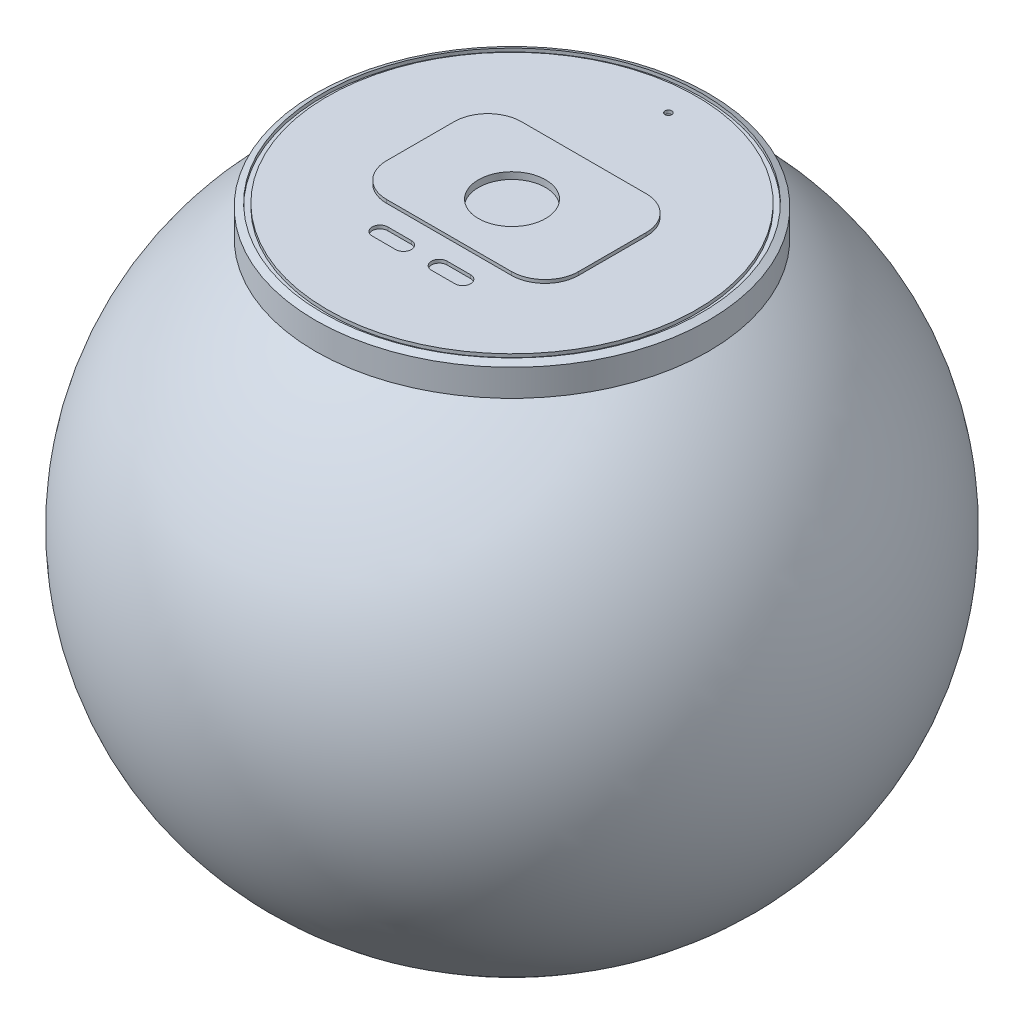
ISO-10303-21;
HEADER;
FILE_DESCRIPTION(('STEP AP214'),'2;1');
FILE_NAME('part.step','',(''),(''),'','','');
FILE_SCHEMA(('AUTOMOTIVE_DESIGN { 1 0 10303 214 1 1 1 1 }'));
ENDSEC;
DATA;
#1=APPLICATION_CONTEXT('core data for automotive mechanical design processes');
#2=APPLICATION_PROTOCOL_DEFINITION('international standard','automotive_design',2000,#1);
#3=PRODUCT_CONTEXT('',#1,'mechanical');
#4=PRODUCT('Part','Part','',(#3));
#5=PRODUCT_RELATED_PRODUCT_CATEGORY('part','',(#4));
#6=PRODUCT_DEFINITION_FORMATION('','',#4);
#7=PRODUCT_DEFINITION_CONTEXT('part definition',#1,'design');
#8=PRODUCT_DEFINITION('design','',#6,#7);
#9=PRODUCT_DEFINITION_SHAPE('','',#8);
#10=(LENGTH_UNIT() NAMED_UNIT(*) SI_UNIT(.MILLI.,.METRE.));
#11=(NAMED_UNIT(*) PLANE_ANGLE_UNIT() SI_UNIT($,.RADIAN.));
#12=(NAMED_UNIT(*) SI_UNIT($,.STERADIAN.) SOLID_ANGLE_UNIT());
#13=UNCERTAINTY_MEASURE_WITH_UNIT(LENGTH_MEASURE(1.E-05),#10,'distance_accuracy_value','');
#14=(GEOMETRIC_REPRESENTATION_CONTEXT(3) GLOBAL_UNCERTAINTY_ASSIGNED_CONTEXT((#13)) GLOBAL_UNIT_ASSIGNED_CONTEXT((#10,
#11,#12)) REPRESENTATION_CONTEXT('',''));
#15=CARTESIAN_POINT('',(0.,0.,0.));
#16=DIRECTION('',(0.,0.,1.));
#17=DIRECTION('',(1.,0.,0.));
#18=AXIS2_PLACEMENT_3D('',#15,#16,#17);
#19=CARTESIAN_POINT('',(0.,46.5,0.));
#20=DIRECTION('',(0.,1.,0.));
#21=DIRECTION('',(0.,0.,1.));
#22=AXIS2_PLACEMENT_3D('',#19,#20,#21);
#23=PLANE('',#22);
#24=CARTESIAN_POINT('',(0.,46.5,-23.2655117960917));
#25=DIRECTION('',(0.,1.,0.));
#26=DIRECTION('',(0.,0.,1.));
#27=AXIS2_PLACEMENT_3D('',#24,#25,#26);
#28=CIRCLE('',#27,0.5);
#29=CARTESIAN_POINT('',(0.,46.5,-22.7655117960917));
#30=VERTEX_POINT('',#29);
#31=EDGE_CURVE('E687',#30,#30,#28,.T.);
#32=ORIENTED_EDGE('',*,*,#31,.F.);
#33=EDGE_LOOP('',(#32));
#34=FACE_BOUND('',#33,.T.);
#35=CARTESIAN_POINT('',(2.66243900689331,46.5,13.4836984969019));
#36=DIRECTION('',(0.,1.,0.));
#37=DIRECTION('',(0.,0.,1.));
#38=AXIS2_PLACEMENT_3D('',#35,#36,#37);
#39=CIRCLE('',#38,1.16816311245161);
#40=CARTESIAN_POINT('',(2.66243900689331,46.5,12.3155353844502));
#41=VERTEX_POINT('',#40);
#42=CARTESIAN_POINT('',(2.66243900689331,46.5,14.6518616093535));
#43=VERTEX_POINT('',#42);
#44=EDGE_CURVE('E183',#41,#43,#39,.T.);
#45=ORIENTED_EDGE('',*,*,#44,.F.);
#46=DIRECTION('',(1.,0.,0.));
#47=VECTOR('',#46,1.);
#48=CARTESIAN_POINT('',(2.66243900689331,46.5,12.3155353844502));
#49=LINE('',#48,#47);
#50=CARTESIAN_POINT('',(6.158792875633,46.5,12.3155353844502));
#51=VERTEX_POINT('',#50);
#52=EDGE_CURVE('E198',#41,#51,#49,.T.);
#53=ORIENTED_EDGE('',*,*,#52,.T.);
#54=CARTESIAN_POINT('',(6.158792875633,46.5,13.4836984969019));
#55=DIRECTION('',(0.,-1.,0.));
#56=DIRECTION('',(0.,0.,-1.));
#57=AXIS2_PLACEMENT_3D('',#54,#55,#56);
#58=CIRCLE('',#57,1.16816311245161);
#59=CARTESIAN_POINT('',(6.158792875633,46.5,14.6518616093535));
#60=VERTEX_POINT('',#59);
#61=EDGE_CURVE('E211',#51,#60,#58,.T.);
#62=ORIENTED_EDGE('',*,*,#61,.T.);
#63=DIRECTION('',(-1.,0.,0.));
#64=VECTOR('',#63,1.);
#65=CARTESIAN_POINT('',(6.158792875633,46.5,14.6518616093535));
#66=LINE('',#65,#64);
#67=EDGE_CURVE('E187',#60,#43,#66,.T.);
#68=ORIENTED_EDGE('',*,*,#67,.T.);
#69=EDGE_LOOP('',(#45,#53,#62,#68));
#70=FACE_BOUND('',#69,.T.);
#71=CARTESIAN_POINT('',(-6.158792875633,46.5,13.4836984969019));
#72=DIRECTION('',(0.,1.,0.));
#73=DIRECTION('',(0.,0.,1.));
#74=AXIS2_PLACEMENT_3D('',#71,#72,#73);
#75=CIRCLE('',#74,1.16816311245161);
#76=CARTESIAN_POINT('',(-6.158792875633,46.5,12.3155353844502));
#77=VERTEX_POINT('',#76);
#78=CARTESIAN_POINT('',(-6.158792875633,46.5,14.6518616093535));
#79=VERTEX_POINT('',#78);
#80=EDGE_CURVE('E221',#77,#79,#75,.T.);
#81=ORIENTED_EDGE('',*,*,#80,.F.);
#82=DIRECTION('',(-1.,0.,0.));
#83=VECTOR('',#82,1.);
#84=CARTESIAN_POINT('',(-2.66243900689331,46.5,12.3155353844502));
#85=LINE('',#84,#83);
#86=CARTESIAN_POINT('',(-2.66243900689331,46.5,12.3155353844502));
#87=VERTEX_POINT('',#86);
#88=EDGE_CURVE('E236',#87,#77,#85,.T.);
#89=ORIENTED_EDGE('',*,*,#88,.F.);
#90=CARTESIAN_POINT('',(-2.66243900689331,46.5,13.4836984969019));
#91=DIRECTION('',(0.,-1.,0.));
#92=DIRECTION('',(0.,0.,-1.));
#93=AXIS2_PLACEMENT_3D('',#90,#91,#92);
#94=CIRCLE('',#93,1.16816311245161);
#95=CARTESIAN_POINT('',(-2.66243900689331,46.5,14.6518616093535));
#96=VERTEX_POINT('',#95);
#97=EDGE_CURVE('E254',#87,#96,#94,.T.);
#98=ORIENTED_EDGE('',*,*,#97,.T.);
#99=DIRECTION('',(1.,0.,0.));
#100=VECTOR('',#99,1.);
#101=CARTESIAN_POINT('',(-6.158792875633,46.5,14.6518616093535));
#102=LINE('',#101,#100);
#103=EDGE_CURVE('E250',#79,#96,#102,.T.);
#104=ORIENTED_EDGE('',*,*,#103,.F.);
#105=EDGE_LOOP('',(#81,#89,#98,#104));
#106=FACE_BOUND('',#105,.T.);
#107=CARTESIAN_POINT('',(0.,46.5,0.));
#108=DIRECTION('',(0.,1.,0.));
#109=DIRECTION('',(0.,0.,1.));
#110=AXIS2_PLACEMENT_3D('',#107,#108,#109);
#111=CIRCLE('',#110,27.4760373096274);
#112=CARTESIAN_POINT('',(0.,46.5,27.4760373096274));
#113=VERTEX_POINT('',#112);
#114=EDGE_CURVE('E264',#113,#113,#111,.T.);
#115=ORIENTED_EDGE('',*,*,#114,.T.);
#116=EDGE_LOOP('',(#115));
#117=FACE_BOUND('',#116,.T.);
#118=DIRECTION('',(-1.,0.,0.));
#119=VECTOR('',#118,1.);
#120=CARTESIAN_POINT('',(9.28476175773685,46.5,-10.6836380376832));
#121=LINE('',#120,#119);
#122=CARTESIAN_POINT('',(9.28476175773685,46.5,-10.6836380376832));
#123=VERTEX_POINT('',#122);
#124=CARTESIAN_POINT('',(-9.28476175773685,46.5,-10.6836380376832));
#125=VERTEX_POINT('',#124);
#126=EDGE_CURVE('E60',#123,#125,#121,.T.);
#127=ORIENTED_EDGE('',*,*,#126,.F.);
#128=CARTESIAN_POINT('',(9.28476175773688,46.5,-5.6836380376832));
#129=DIRECTION('',(0.,1.,0.));
#130=DIRECTION('',(0.,0.,1.));
#131=AXIS2_PLACEMENT_3D('',#128,#129,#130);
#132=CIRCLE('',#131,5.);
#133=CARTESIAN_POINT('',(14.2847617577369,46.5,-5.68363803768316));
#134=VERTEX_POINT('',#133);
#135=EDGE_CURVE('E181',#134,#123,#132,.T.);
#136=ORIENTED_EDGE('',*,*,#135,.F.);
#137=DIRECTION('',(0.,0.,1.));
#138=VECTOR('',#137,1.);
#139=CARTESIAN_POINT('',(14.2847617577369,46.5,-5.68363803768316));
#140=LINE('',#139,#138);
#141=CARTESIAN_POINT('',(14.2847617577369,46.5,4.36761589266245));
#142=VERTEX_POINT('',#141);
#143=EDGE_CURVE('E178',#134,#142,#140,.T.);
#144=ORIENTED_EDGE('',*,*,#143,.T.);
#145=CARTESIAN_POINT('',(9.28476175773688,46.5,4.36761589266248));
#146=DIRECTION('',(0.,-1.,0.));
#147=DIRECTION('',(0.,0.,-1.));
#148=AXIS2_PLACEMENT_3D('',#145,#146,#147);
#149=CIRCLE('',#148,5.);
#150=CARTESIAN_POINT('',(9.28476175773688,46.5,9.36761589266248));
#151=VERTEX_POINT('',#150);
#152=EDGE_CURVE('E736',#142,#151,#149,.T.);
#153=ORIENTED_EDGE('',*,*,#152,.T.);
#154=DIRECTION('',(1.,0.,0.));
#155=VECTOR('',#154,1.);
#156=CARTESIAN_POINT('',(-9.28476175773685,46.5,9.36761589266248));
#157=LINE('',#156,#155);
#158=CARTESIAN_POINT('',(-9.28476175773685,46.5,9.36761589266248));
#159=VERTEX_POINT('',#158);
#160=EDGE_CURVE('E732',#159,#151,#157,.T.);
#161=ORIENTED_EDGE('',*,*,#160,.F.);
#162=CARTESIAN_POINT('',(-9.28476175773688,46.5,4.36761589266248));
#163=DIRECTION('',(0.,1.,0.));
#164=DIRECTION('',(0.,0.,1.));
#165=AXIS2_PLACEMENT_3D('',#162,#163,#164);
#166=CIRCLE('',#165,5.);
#167=CARTESIAN_POINT('',(-14.2847617577369,46.5,4.36761589266245));
#168=VERTEX_POINT('',#167);
#169=EDGE_CURVE('E728',#168,#159,#166,.T.);
#170=ORIENTED_EDGE('',*,*,#169,.F.);
#171=DIRECTION('',(0.,0.,1.));
#172=VECTOR('',#171,1.);
#173=CARTESIAN_POINT('',(-14.2847617577369,46.5,-5.68363803768316));
#174=LINE('',#173,#172);
#175=CARTESIAN_POINT('',(-14.2847617577369,46.5,-5.68363803768316));
#176=VERTEX_POINT('',#175);
#177=EDGE_CURVE('E724',#176,#168,#174,.T.);
#178=ORIENTED_EDGE('',*,*,#177,.F.);
#179=CARTESIAN_POINT('',(-9.28476175773688,46.5,-5.6836380376832));
#180=DIRECTION('',(0.,1.,0.));
#181=DIRECTION('',(0.,0.,1.));
#182=AXIS2_PLACEMENT_3D('',#179,#180,#181);
#183=CIRCLE('',#182,5.);
#184=EDGE_CURVE('E65',#125,#176,#183,.T.);
#185=ORIENTED_EDGE('',*,*,#184,.F.);
#186=EDGE_LOOP('',(#127,#136,#144,#153,#161,#170,#178,#185));
#187=FACE_BOUND('',#186,.T.);
#188=ADVANCED_FACE('F44',(#34,#70,#106,#117,#187),#23,.T.);
#189=CARTESIAN_POINT('',(0.,4.69373689625829,0.));
#190=DIRECTION('',(0.,-1.,0.));
#191=DIRECTION('',(1.,0.,0.));
#192=AXIS2_PLACEMENT_3D('',#189,#190,#191);
#193=DEGENERATE_TOROIDAL_SURFACE('',#192,4.0728030425194,45.,.T.);
#194=CARTESIAN_POINT('',(0.,42.,0.));
#195=DIRECTION('',(0.,-1.,0.));
#196=DIRECTION('',(0.,0.,-1.));
#197=AXIS2_PLACEMENT_3D('',#194,#195,#196);
#198=CIRCLE('',#197,29.2371177209365);
#199=CARTESIAN_POINT('',(0.,42.,-29.2371177209365));
#200=VERTEX_POINT('',#199);
#201=EDGE_CURVE('E286',#200,#200,#198,.T.);
#202=ORIENTED_EDGE('',*,*,#201,.T.);
#203=EDGE_LOOP('',(#202));
#204=FACE_BOUND('',#203,.T.);
#205=CARTESIAN_POINT('',(0.,-35.,0.));
#206=DIRECTION('',(0.,-1.,0.));
#207=DIRECTION('',(1.,0.,0.));
#208=AXIS2_PLACEMENT_3D('',#205,#206,#207);
#209=CIRCLE('',#208,25.272030651341);
#210=CARTESIAN_POINT('',(25.272030651341,-35.,0.));
#211=VERTEX_POINT('',#210);
#212=EDGE_CURVE('E11',#211,#211,#209,.T.);
#213=ORIENTED_EDGE('',*,*,#212,.F.);
#214=EDGE_LOOP('',(#213));
#215=FACE_BOUND('',#214,.T.);
#216=ADVANCED_FACE('F46',(#204,#215),#193,.T.);
#217=CARTESIAN_POINT('',(0.,-35.,0.));
#218=DIRECTION('',(0.,1.,0.));
#219=DIRECTION('',(-1.,0.,0.));
#220=AXIS2_PLACEMENT_3D('',#217,#218,#219);
#221=PLANE('',#220);
#222=ORIENTED_EDGE('',*,*,#212,.T.);
#223=EDGE_LOOP('',(#222));
#224=FACE_BOUND('',#223,.T.);
#225=ADVANCED_FACE('F301',(#224),#221,.F.);
#226=CARTESIAN_POINT('',(0.,46.5,0.));
#227=DIRECTION('',(0.,-1.,0.));
#228=DIRECTION('',(0.,0.,-1.));
#229=AXIS2_PLACEMENT_3D('',#226,#227,#228);
#230=CONICAL_SURFACE('',#229,28.2371177209365,1.1071487177941);
#231=CARTESIAN_POINT('',(0.,46.,0.));
#232=DIRECTION('',(0.,-1.,0.));
#233=DIRECTION('',(0.,0.,-1.));
#234=AXIS2_PLACEMENT_3D('',#231,#232,#233);
#235=CIRCLE('',#234,29.2371177209365);
#236=CARTESIAN_POINT('',(0.,46.,-29.2371177209365));
#237=VERTEX_POINT('',#236);
#238=EDGE_CURVE('E53',#237,#237,#235,.T.);
#239=ORIENTED_EDGE('',*,*,#238,.F.);
#240=EDGE_LOOP('',(#239));
#241=FACE_BOUND('',#240,.T.);
#242=CARTESIAN_POINT('',(0.,46.5,0.));
#243=DIRECTION('',(0.,1.,0.));
#244=DIRECTION('',(0.,0.,1.));
#245=AXIS2_PLACEMENT_3D('',#242,#243,#244);
#246=CIRCLE('',#245,28.2371177209365);
#247=CARTESIAN_POINT('',(0.,46.5,28.2371177209365));
#248=VERTEX_POINT('',#247);
#249=EDGE_CURVE('E278',#248,#248,#246,.T.);
#250=ORIENTED_EDGE('',*,*,#249,.F.);
#251=EDGE_LOOP('',(#250));
#252=FACE_BOUND('',#251,.T.);
#253=ADVANCED_FACE('F298',(#241,#252),#230,.T.);
#254=CARTESIAN_POINT('',(0.,0.,0.));
#255=DIRECTION('',(0.,-1.,0.));
#256=DIRECTION('',(0.,0.,-1.));
#257=AXIS2_PLACEMENT_3D('',#254,#255,#256);
#258=CYLINDRICAL_SURFACE('',#257,29.2371177209365);
#259=ORIENTED_EDGE('',*,*,#201,.F.);
#260=EDGE_LOOP('',(#259));
#261=FACE_BOUND('',#260,.T.);
#262=ORIENTED_EDGE('',*,*,#238,.T.);
#263=EDGE_LOOP('',(#262));
#264=FACE_BOUND('',#263,.T.);
#265=ADVANCED_FACE('F296',(#261,#264),#258,.T.);
#266=CARTESIAN_POINT('',(0.,46.,0.));
#267=DIRECTION('',(0.,1.,0.));
#268=DIRECTION('',(0.,0.,1.));
#269=AXIS2_PLACEMENT_3D('',#266,#267,#268);
#270=CYLINDRICAL_SURFACE('',#269,28.2371177209365);
#271=CARTESIAN_POINT('',(0.,46.,0.));
#272=DIRECTION('',(0.,1.,0.));
#273=DIRECTION('',(0.,0.,1.));
#274=AXIS2_PLACEMENT_3D('',#271,#272,#273);
#275=CIRCLE('',#274,28.2371177209365);
#276=CARTESIAN_POINT('',(0.,46.,28.2371177209365));
#277=VERTEX_POINT('',#276);
#278=EDGE_CURVE('E282',#277,#277,#275,.T.);
#279=ORIENTED_EDGE('',*,*,#278,.F.);
#280=EDGE_LOOP('',(#279));
#281=FACE_BOUND('',#280,.T.);
#282=ORIENTED_EDGE('',*,*,#249,.T.);
#283=EDGE_LOOP('',(#282));
#284=FACE_BOUND('',#283,.T.);
#285=ADVANCED_FACE('F305',(#281,#284),#270,.F.);
#286=CARTESIAN_POINT('',(0.,46.,0.));
#287=DIRECTION('',(0.,1.,0.));
#288=DIRECTION('',(0.,0.,1.));
#289=AXIS2_PLACEMENT_3D('',#286,#287,#288);
#290=PLANE('',#289);
#291=CARTESIAN_POINT('',(0.,46.,0.));
#292=DIRECTION('',(0.,1.,0.));
#293=DIRECTION('',(0.,0.,1.));
#294=AXIS2_PLACEMENT_3D('',#291,#292,#293);
#295=CIRCLE('',#294,27.4760373096274);
#296=CARTESIAN_POINT('',(0.,46.,27.4760373096274));
#297=VERTEX_POINT('',#296);
#298=EDGE_CURVE('E274',#297,#297,#295,.T.);
#299=ORIENTED_EDGE('',*,*,#298,.F.);
#300=EDGE_LOOP('',(#299));
#301=FACE_BOUND('',#300,.T.);
#302=ORIENTED_EDGE('',*,*,#278,.T.);
#303=EDGE_LOOP('',(#302));
#304=FACE_BOUND('',#303,.T.);
#305=ADVANCED_FACE('F307',(#301,#304),#290,.T.);
#306=CARTESIAN_POINT('',(0.,46.,0.));
#307=DIRECTION('',(0.,1.,0.));
#308=DIRECTION('',(0.,0.,1.));
#309=AXIS2_PLACEMENT_3D('',#306,#307,#308);
#310=CYLINDRICAL_SURFACE('',#309,27.4760373096274);
#311=ORIENTED_EDGE('',*,*,#298,.T.);
#312=EDGE_LOOP('',(#311));
#313=FACE_BOUND('',#312,.T.);
#314=ORIENTED_EDGE('',*,*,#114,.F.);
#315=EDGE_LOOP('',(#314));
#316=FACE_BOUND('',#315,.T.);
#317=ADVANCED_FACE('F314',(#313,#316),#310,.T.);
#318=CARTESIAN_POINT('',(-6.158792875633,46.,13.4836984969019));
#319=DIRECTION('',(0.,1.,0.));
#320=DIRECTION('',(0.,0.,1.));
#321=AXIS2_PLACEMENT_3D('',#318,#319,#320);
#322=CYLINDRICAL_SURFACE('',#321,1.16816311245161);
#323=ORIENTED_EDGE('',*,*,#80,.T.);
#324=DIRECTION('',(0.,1.,0.));
#325=VECTOR('',#324,1.);
#326=CARTESIAN_POINT('',(-6.158792875633,46.,14.6518616093535));
#327=LINE('',#326,#325);
#328=CARTESIAN_POINT('',(-6.158792875633,46.,14.6518616093535));
#329=VERTEX_POINT('',#328);
#330=EDGE_CURVE('E247',#329,#79,#327,.T.);
#331=ORIENTED_EDGE('',*,*,#330,.F.);
#332=CARTESIAN_POINT('',(-6.158792875633,46.,13.4836984969019));
#333=DIRECTION('',(0.,1.,0.));
#334=DIRECTION('',(0.,0.,1.));
#335=AXIS2_PLACEMENT_3D('',#332,#333,#334);
#336=CIRCLE('',#335,1.16816311245161);
#337=CARTESIAN_POINT('',(-6.158792875633,46.,12.3155353844502));
#338=VERTEX_POINT('',#337);
#339=EDGE_CURVE('E231',#338,#329,#336,.T.);
#340=ORIENTED_EDGE('',*,*,#339,.F.);
#341=DIRECTION('',(0.,1.,0.));
#342=VECTOR('',#341,1.);
#343=CARTESIAN_POINT('',(-6.158792875633,46.,12.3155353844502));
#344=LINE('',#343,#342);
#345=EDGE_CURVE('E261',#338,#77,#344,.T.);
#346=ORIENTED_EDGE('',*,*,#345,.T.);
#347=EDGE_LOOP('',(#323,#331,#340,#346));
#348=FACE_BOUND('',#347,.T.);
#349=ADVANCED_FACE('F576',(#348),#322,.F.);
#350=CARTESIAN_POINT('',(-2.66243900689331,46.,12.3155353844502));
#351=DIRECTION('',(0.,0.,-1.));
#352=DIRECTION('',(-1.,0.,0.));
#353=AXIS2_PLACEMENT_3D('',#350,#351,#352);
#354=PLANE('',#353);
#355=ORIENTED_EDGE('',*,*,#88,.T.);
#356=ORIENTED_EDGE('',*,*,#345,.F.);
#357=DIRECTION('',(-1.,0.,0.));
#358=VECTOR('',#357,1.);
#359=CARTESIAN_POINT('',(-2.66243900689331,46.,12.3155353844502));
#360=LINE('',#359,#358);
#361=CARTESIAN_POINT('',(-2.66243900689331,46.,12.3155353844502));
#362=VERTEX_POINT('',#361);
#363=EDGE_CURVE('E243',#362,#338,#360,.T.);
#364=ORIENTED_EDGE('',*,*,#363,.F.);
#365=DIRECTION('',(0.,1.,0.));
#366=VECTOR('',#365,1.);
#367=CARTESIAN_POINT('',(-2.66243900689331,46.,12.3155353844502));
#368=LINE('',#367,#366);
#369=EDGE_CURVE('E265',#362,#87,#368,.T.);
#370=ORIENTED_EDGE('',*,*,#369,.T.);
#371=EDGE_LOOP('',(#355,#356,#364,#370));
#372=FACE_BOUND('',#371,.T.);
#373=ADVANCED_FACE('F572',(#372),#354,.F.);
#374=CARTESIAN_POINT('',(-2.66243900689331,46.,13.4836984969019));
#375=DIRECTION('',(0.,1.,0.));
#376=DIRECTION('',(0.,0.,1.));
#377=AXIS2_PLACEMENT_3D('',#374,#375,#376);
#378=CYLINDRICAL_SURFACE('',#377,1.16816311245161);
#379=ORIENTED_EDGE('',*,*,#97,.F.);
#380=ORIENTED_EDGE('',*,*,#369,.F.);
#381=CARTESIAN_POINT('',(-2.66243900689331,46.,13.4836984969019));
#382=DIRECTION('',(0.,-1.,0.));
#383=DIRECTION('',(0.,0.,-1.));
#384=AXIS2_PLACEMENT_3D('',#381,#382,#383);
#385=CIRCLE('',#384,1.16816311245161);
#386=CARTESIAN_POINT('',(-2.66243900689331,46.,14.6518616093535));
#387=VERTEX_POINT('',#386);
#388=EDGE_CURVE('E240',#362,#387,#385,.T.);
#389=ORIENTED_EDGE('',*,*,#388,.T.);
#390=DIRECTION('',(0.,1.,0.));
#391=VECTOR('',#390,1.);
#392=CARTESIAN_POINT('',(-2.66243900689331,46.,14.6518616093535));
#393=LINE('',#392,#391);
#394=EDGE_CURVE('E268',#387,#96,#393,.T.);
#395=ORIENTED_EDGE('',*,*,#394,.T.);
#396=EDGE_LOOP('',(#379,#380,#389,#395));
#397=FACE_BOUND('',#396,.T.);
#398=ADVANCED_FACE('F575',(#397),#378,.F.);
#399=CARTESIAN_POINT('',(-6.158792875633,46.,14.6518616093535));
#400=DIRECTION('',(0.,0.,1.));
#401=DIRECTION('',(1.,0.,0.));
#402=AXIS2_PLACEMENT_3D('',#399,#400,#401);
#403=PLANE('',#402);
#404=ORIENTED_EDGE('',*,*,#103,.T.);
#405=ORIENTED_EDGE('',*,*,#394,.F.);
#406=DIRECTION('',(1.,0.,0.));
#407=VECTOR('',#406,1.);
#408=CARTESIAN_POINT('',(-6.158792875633,46.,14.6518616093535));
#409=LINE('',#408,#407);
#410=EDGE_CURVE('E235',#329,#387,#409,.T.);
#411=ORIENTED_EDGE('',*,*,#410,.F.);
#412=ORIENTED_EDGE('',*,*,#330,.T.);
#413=EDGE_LOOP('',(#404,#405,#411,#412));
#414=FACE_BOUND('',#413,.T.);
#415=ADVANCED_FACE('F389',(#414),#403,.F.);
#416=CARTESIAN_POINT('',(-6.158792875633,46.,13.4836984969019));
#417=DIRECTION('',(0.,1.,0.));
#418=DIRECTION('',(0.,0.,1.));
#419=AXIS2_PLACEMENT_3D('',#416,#417,#418);
#420=PLANE('',#419);
#421=ORIENTED_EDGE('',*,*,#339,.T.);
#422=ORIENTED_EDGE('',*,*,#410,.T.);
#423=ORIENTED_EDGE('',*,*,#388,.F.);
#424=ORIENTED_EDGE('',*,*,#363,.T.);
#425=EDGE_LOOP('',(#421,#422,#423,#424));
#426=FACE_BOUND('',#425,.T.);
#427=ADVANCED_FACE('F384',(#426),#420,.T.);
#428=CARTESIAN_POINT('',(2.66243900689331,46.,13.4836984969019));
#429=DIRECTION('',(0.,1.,0.));
#430=DIRECTION('',(0.,0.,1.));
#431=AXIS2_PLACEMENT_3D('',#428,#429,#430);
#432=CYLINDRICAL_SURFACE('',#431,1.16816311245161);
#433=ORIENTED_EDGE('',*,*,#44,.T.);
#434=DIRECTION('',(0.,1.,0.));
#435=VECTOR('',#434,1.);
#436=CARTESIAN_POINT('',(2.66243900689331,46.,14.6518616093535));
#437=LINE('',#436,#435);
#438=CARTESIAN_POINT('',(2.66243900689331,46.,14.6518616093535));
#439=VERTEX_POINT('',#438);
#440=EDGE_CURVE('E206',#439,#43,#437,.T.);
#441=ORIENTED_EDGE('',*,*,#440,.F.);
#442=CARTESIAN_POINT('',(2.66243900689331,46.,13.4836984969019));
#443=DIRECTION('',(0.,1.,0.));
#444=DIRECTION('',(0.,0.,1.));
#445=AXIS2_PLACEMENT_3D('',#442,#443,#444);
#446=CIRCLE('',#445,1.16816311245161);
#447=CARTESIAN_POINT('',(2.66243900689331,46.,12.3155353844502));
#448=VERTEX_POINT('',#447);
#449=EDGE_CURVE('E193',#448,#439,#446,.T.);
#450=ORIENTED_EDGE('',*,*,#449,.F.);
#451=DIRECTION('',(0.,1.,0.));
#452=VECTOR('',#451,1.);
#453=CARTESIAN_POINT('',(2.66243900689331,46.,12.3155353844502));
#454=LINE('',#453,#452);
#455=EDGE_CURVE('E218',#448,#41,#454,.T.);
#456=ORIENTED_EDGE('',*,*,#455,.T.);
#457=EDGE_LOOP('',(#433,#441,#450,#456));
#458=FACE_BOUND('',#457,.T.);
#459=ADVANCED_FACE('F388',(#458),#432,.F.);
#460=CARTESIAN_POINT('',(2.66243900689331,46.,12.3155353844502));
#461=DIRECTION('',(0.,0.,1.));
#462=DIRECTION('',(1.,0.,0.));
#463=AXIS2_PLACEMENT_3D('',#460,#461,#462);
#464=PLANE('',#463);
#465=ORIENTED_EDGE('',*,*,#52,.F.);
#466=ORIENTED_EDGE('',*,*,#455,.F.);
#467=DIRECTION('',(1.,0.,0.));
#468=VECTOR('',#467,1.);
#469=CARTESIAN_POINT('',(2.66243900689331,46.,12.3155353844502));
#470=LINE('',#469,#468);
#471=CARTESIAN_POINT('',(6.158792875633,46.,12.3155353844502));
#472=VERTEX_POINT('',#471);
#473=EDGE_CURVE('E204',#448,#472,#470,.T.);
#474=ORIENTED_EDGE('',*,*,#473,.T.);
#475=DIRECTION('',(0.,1.,0.));
#476=VECTOR('',#475,1.);
#477=CARTESIAN_POINT('',(6.158792875633,46.,12.3155353844502));
#478=LINE('',#477,#476);
#479=EDGE_CURVE('E222',#472,#51,#478,.T.);
#480=ORIENTED_EDGE('',*,*,#479,.T.);
#481=EDGE_LOOP('',(#465,#466,#474,#480));
#482=FACE_BOUND('',#481,.T.);
#483=ADVANCED_FACE('F403',(#482),#464,.T.);
#484=CARTESIAN_POINT('',(6.158792875633,46.,13.4836984969019));
#485=DIRECTION('',(0.,1.,0.));
#486=DIRECTION('',(0.,0.,1.));
#487=AXIS2_PLACEMENT_3D('',#484,#485,#486);
#488=CYLINDRICAL_SURFACE('',#487,1.16816311245161);
#489=ORIENTED_EDGE('',*,*,#61,.F.);
#490=ORIENTED_EDGE('',*,*,#479,.F.);
#491=CARTESIAN_POINT('',(6.158792875633,46.,13.4836984969019));
#492=DIRECTION('',(0.,-1.,0.));
#493=DIRECTION('',(0.,0.,-1.));
#494=AXIS2_PLACEMENT_3D('',#491,#492,#493);
#495=CIRCLE('',#494,1.16816311245161);
#496=CARTESIAN_POINT('',(6.158792875633,46.,14.6518616093535));
#497=VERTEX_POINT('',#496);
#498=EDGE_CURVE('E201',#472,#497,#495,.T.);
#499=ORIENTED_EDGE('',*,*,#498,.T.);
#500=DIRECTION('',(0.,1.,0.));
#501=VECTOR('',#500,1.);
#502=CARTESIAN_POINT('',(6.158792875633,46.,14.6518616093535));
#503=LINE('',#502,#501);
#504=EDGE_CURVE('E225',#497,#60,#503,.T.);
#505=ORIENTED_EDGE('',*,*,#504,.T.);
#506=EDGE_LOOP('',(#489,#490,#499,#505));
#507=FACE_BOUND('',#506,.T.);
#508=ADVANCED_FACE('F411',(#507),#488,.F.);
#509=CARTESIAN_POINT('',(6.158792875633,46.,14.6518616093535));
#510=DIRECTION('',(0.,0.,-1.));
#511=DIRECTION('',(-1.,0.,0.));
#512=AXIS2_PLACEMENT_3D('',#509,#510,#511);
#513=PLANE('',#512);
#514=ORIENTED_EDGE('',*,*,#67,.F.);
#515=ORIENTED_EDGE('',*,*,#504,.F.);
#516=DIRECTION('',(-1.,0.,0.));
#517=VECTOR('',#516,1.);
#518=CARTESIAN_POINT('',(6.158792875633,46.,14.6518616093535));
#519=LINE('',#518,#517);
#520=EDGE_CURVE('E197',#497,#439,#519,.T.);
#521=ORIENTED_EDGE('',*,*,#520,.T.);
#522=ORIENTED_EDGE('',*,*,#440,.T.);
#523=EDGE_LOOP('',(#514,#515,#521,#522));
#524=FACE_BOUND('',#523,.T.);
#525=ADVANCED_FACE('F359',(#524),#513,.T.);
#526=CARTESIAN_POINT('',(2.66243900689331,46.,13.4836984969019));
#527=DIRECTION('',(0.,1.,0.));
#528=DIRECTION('',(0.,0.,1.));
#529=AXIS2_PLACEMENT_3D('',#526,#527,#528);
#530=PLANE('',#529);
#531=ORIENTED_EDGE('',*,*,#449,.T.);
#532=ORIENTED_EDGE('',*,*,#520,.F.);
#533=ORIENTED_EDGE('',*,*,#498,.F.);
#534=ORIENTED_EDGE('',*,*,#473,.F.);
#535=EDGE_LOOP('',(#531,#532,#533,#534));
#536=FACE_BOUND('',#535,.T.);
#537=ADVANCED_FACE('F354',(#536),#530,.T.);
#538=CARTESIAN_POINT('',(9.28476175773688,47.,-5.6836380376832));
#539=DIRECTION('',(0.,-1.,0.));
#540=DIRECTION('',(0.,0.,-1.));
#541=AXIS2_PLACEMENT_3D('',#538,#539,#540);
#542=CYLINDRICAL_SURFACE('',#541,5.);
#543=ORIENTED_EDGE('',*,*,#135,.T.);
#544=DIRECTION('',(0.,-1.,0.));
#545=VECTOR('',#544,1.);
#546=CARTESIAN_POINT('',(9.28476175773685,47.,-10.6836380376832));
#547=LINE('',#546,#545);
#548=CARTESIAN_POINT('',(9.28476175773685,47.,-10.6836380376832));
#549=VERTEX_POINT('',#548);
#550=EDGE_CURVE('E159',#549,#123,#547,.T.);
#551=ORIENTED_EDGE('',*,*,#550,.F.);
#552=CARTESIAN_POINT('',(9.28476175773688,47.,-5.6836380376832));
#553=DIRECTION('',(0.,1.,0.));
#554=DIRECTION('',(0.,0.,1.));
#555=AXIS2_PLACEMENT_3D('',#552,#553,#554);
#556=CIRCLE('',#555,5.);
#557=CARTESIAN_POINT('',(14.2847617577369,47.,-5.68363803768316));
#558=VERTEX_POINT('',#557);
#559=EDGE_CURVE('E167',#558,#549,#556,.T.);
#560=ORIENTED_EDGE('',*,*,#559,.F.);
#561=DIRECTION('',(0.,-1.,0.));
#562=VECTOR('',#561,1.);
#563=CARTESIAN_POINT('',(14.2847617577369,47.,-5.68363803768316));
#564=LINE('',#563,#562);
#565=EDGE_CURVE('E717',#558,#134,#564,.T.);
#566=ORIENTED_EDGE('',*,*,#565,.T.);
#567=EDGE_LOOP('',(#543,#551,#560,#566));
#568=FACE_BOUND('',#567,.T.);
#569=ADVANCED_FACE('F180',(#568),#542,.T.);
#570=CARTESIAN_POINT('',(9.28476175773685,47.,-10.6836380376832));
#571=DIRECTION('',(0.,0.,1.));
#572=DIRECTION('',(1.,0.,0.));
#573=AXIS2_PLACEMENT_3D('',#570,#571,#572);
#574=PLANE('',#573);
#575=ORIENTED_EDGE('',*,*,#126,.T.);
#576=DIRECTION('',(0.,-1.,0.));
#577=VECTOR('',#576,1.);
#578=CARTESIAN_POINT('',(-9.28476175773685,47.,-10.6836380376832));
#579=LINE('',#578,#577);
#580=CARTESIAN_POINT('',(-9.28476175773685,47.,-10.6836380376832));
#581=VERTEX_POINT('',#580);
#582=EDGE_CURVE('E162',#581,#125,#579,.T.);
#583=ORIENTED_EDGE('',*,*,#582,.F.);
#584=DIRECTION('',(-1.,0.,0.));
#585=VECTOR('',#584,1.);
#586=CARTESIAN_POINT('',(9.28476175773685,47.,-10.6836380376832));
#587=LINE('',#586,#585);
#588=EDGE_CURVE('E155',#549,#581,#587,.T.);
#589=ORIENTED_EDGE('',*,*,#588,.F.);
#590=ORIENTED_EDGE('',*,*,#550,.T.);
#591=EDGE_LOOP('',(#575,#583,#589,#590));
#592=FACE_BOUND('',#591,.T.);
#593=ADVANCED_FACE('F157',(#592),#574,.F.);
#594=CARTESIAN_POINT('',(-9.28476175773688,47.,-5.6836380376832));
#595=DIRECTION('',(0.,-1.,0.));
#596=DIRECTION('',(0.,0.,-1.));
#597=AXIS2_PLACEMENT_3D('',#594,#595,#596);
#598=CYLINDRICAL_SURFACE('',#597,5.);
#599=ORIENTED_EDGE('',*,*,#184,.T.);
#600=DIRECTION('',(0.,-1.,0.));
#601=VECTOR('',#600,1.);
#602=CARTESIAN_POINT('',(-14.2847617577369,47.,-5.68363803768316));
#603=LINE('',#602,#601);
#604=CARTESIAN_POINT('',(-14.2847617577369,47.,-5.68363803768316));
#605=VERTEX_POINT('',#604);
#606=EDGE_CURVE('E189',#605,#176,#603,.T.);
#607=ORIENTED_EDGE('',*,*,#606,.F.);
#608=CARTESIAN_POINT('',(-9.28476175773688,47.,-5.6836380376832));
#609=DIRECTION('',(0.,1.,0.));
#610=DIRECTION('',(0.,0.,1.));
#611=AXIS2_PLACEMENT_3D('',#608,#609,#610);
#612=CIRCLE('',#611,5.);
#613=EDGE_CURVE('E166',#581,#605,#612,.T.);
#614=ORIENTED_EDGE('',*,*,#613,.F.);
#615=ORIENTED_EDGE('',*,*,#582,.T.);
#616=EDGE_LOOP('',(#599,#607,#614,#615));
#617=FACE_BOUND('',#616,.T.);
#618=ADVANCED_FACE('F459',(#617),#598,.T.);
#619=CARTESIAN_POINT('',(-14.2847617577369,47.,-5.68363803768316));
#620=DIRECTION('',(1.,0.,0.));
#621=DIRECTION('',(0.,0.,-1.));
#622=AXIS2_PLACEMENT_3D('',#619,#620,#621);
#623=PLANE('',#622);
#624=ORIENTED_EDGE('',*,*,#177,.T.);
#625=DIRECTION('',(0.,-1.,0.));
#626=VECTOR('',#625,1.);
#627=CARTESIAN_POINT('',(-14.2847617577369,47.,4.36761589266245));
#628=LINE('',#627,#626);
#629=CARTESIAN_POINT('',(-14.2847617577369,47.,4.36761589266245));
#630=VERTEX_POINT('',#629);
#631=EDGE_CURVE('E755',#630,#168,#628,.T.);
#632=ORIENTED_EDGE('',*,*,#631,.F.);
#633=DIRECTION('',(0.,0.,1.));
#634=VECTOR('',#633,1.);
#635=CARTESIAN_POINT('',(-14.2847617577369,47.,-5.68363803768316));
#636=LINE('',#635,#634);
#637=EDGE_CURVE('E702',#605,#630,#636,.T.);
#638=ORIENTED_EDGE('',*,*,#637,.F.);
#639=ORIENTED_EDGE('',*,*,#606,.T.);
#640=EDGE_LOOP('',(#624,#632,#638,#639));
#641=FACE_BOUND('',#640,.T.);
#642=ADVANCED_FACE('F469',(#641),#623,.F.);
#643=CARTESIAN_POINT('',(-9.28476175773688,47.,4.36761589266248));
#644=DIRECTION('',(0.,-1.,0.));
#645=DIRECTION('',(0.,0.,-1.));
#646=AXIS2_PLACEMENT_3D('',#643,#644,#645);
#647=CYLINDRICAL_SURFACE('',#646,5.);
#648=ORIENTED_EDGE('',*,*,#169,.T.);
#649=DIRECTION('',(0.,-1.,0.));
#650=VECTOR('',#649,1.);
#651=CARTESIAN_POINT('',(-9.28476175773685,47.,9.36761589266248));
#652=LINE('',#651,#650);
#653=CARTESIAN_POINT('',(-9.28476175773685,47.,9.36761589266248));
#654=VERTEX_POINT('',#653);
#655=EDGE_CURVE('E751',#654,#159,#652,.T.);
#656=ORIENTED_EDGE('',*,*,#655,.F.);
#657=CARTESIAN_POINT('',(-9.28476175773688,47.,4.36761589266248));
#658=DIRECTION('',(0.,1.,0.));
#659=DIRECTION('',(0.,0.,1.));
#660=AXIS2_PLACEMENT_3D('',#657,#658,#659);
#661=CIRCLE('',#660,5.);
#662=EDGE_CURVE('E705',#630,#654,#661,.T.);
#663=ORIENTED_EDGE('',*,*,#662,.F.);
#664=ORIENTED_EDGE('',*,*,#631,.T.);
#665=EDGE_LOOP('',(#648,#656,#663,#664));
#666=FACE_BOUND('',#665,.T.);
#667=ADVANCED_FACE('F480',(#666),#647,.T.);
#668=CARTESIAN_POINT('',(-9.28476175773685,47.,9.36761589266248));
#669=DIRECTION('',(0.,0.,-1.));
#670=DIRECTION('',(-1.,0.,0.));
#671=AXIS2_PLACEMENT_3D('',#668,#669,#670);
#672=PLANE('',#671);
#673=ORIENTED_EDGE('',*,*,#160,.T.);
#674=DIRECTION('',(0.,-1.,0.));
#675=VECTOR('',#674,1.);
#676=CARTESIAN_POINT('',(9.28476175773685,47.,9.36761589266248));
#677=LINE('',#676,#675);
#678=CARTESIAN_POINT('',(9.28476175773685,47.,9.36761589266248));
#679=VERTEX_POINT('',#678);
#680=EDGE_CURVE('E747',#679,#151,#677,.T.);
#681=ORIENTED_EDGE('',*,*,#680,.F.);
#682=DIRECTION('',(1.,0.,0.));
#683=VECTOR('',#682,1.);
#684=CARTESIAN_POINT('',(-9.28476175773685,47.,9.36761589266248));
#685=LINE('',#684,#683);
#686=EDGE_CURVE('E708',#654,#679,#685,.T.);
#687=ORIENTED_EDGE('',*,*,#686,.F.);
#688=ORIENTED_EDGE('',*,*,#655,.T.);
#689=EDGE_LOOP('',(#673,#681,#687,#688));
#690=FACE_BOUND('',#689,.T.);
#691=ADVANCED_FACE('F491',(#690),#672,.F.);
#692=CARTESIAN_POINT('',(9.28476175773688,47.,4.36761589266248));
#693=DIRECTION('',(0.,-1.,0.));
#694=DIRECTION('',(0.,0.,-1.));
#695=AXIS2_PLACEMENT_3D('',#692,#693,#694);
#696=CYLINDRICAL_SURFACE('',#695,5.);
#697=ORIENTED_EDGE('',*,*,#152,.F.);
#698=DIRECTION('',(0.,-1.,0.));
#699=VECTOR('',#698,1.);
#700=CARTESIAN_POINT('',(14.2847617577369,47.,4.36761589266245));
#701=LINE('',#700,#699);
#702=CARTESIAN_POINT('',(14.2847617577369,47.,4.36761589266245));
#703=VERTEX_POINT('',#702);
#704=EDGE_CURVE('E743',#703,#142,#701,.T.);
#705=ORIENTED_EDGE('',*,*,#704,.F.);
#706=CARTESIAN_POINT('',(9.28476175773688,47.,4.36761589266248));
#707=DIRECTION('',(0.,-1.,0.));
#708=DIRECTION('',(0.,0.,-1.));
#709=AXIS2_PLACEMENT_3D('',#706,#707,#708);
#710=CIRCLE('',#709,5.);
#711=EDGE_CURVE('E711',#703,#679,#710,.T.);
#712=ORIENTED_EDGE('',*,*,#711,.T.);
#713=ORIENTED_EDGE('',*,*,#680,.T.);
#714=EDGE_LOOP('',(#697,#705,#712,#713));
#715=FACE_BOUND('',#714,.T.);
#716=ADVANCED_FACE('F502',(#715),#696,.T.);
#717=CARTESIAN_POINT('',(14.2847617577369,47.,-5.68363803768316));
#718=DIRECTION('',(1.,0.,0.));
#719=DIRECTION('',(0.,0.,-1.));
#720=AXIS2_PLACEMENT_3D('',#717,#718,#719);
#721=PLANE('',#720);
#722=ORIENTED_EDGE('',*,*,#143,.F.);
#723=ORIENTED_EDGE('',*,*,#565,.F.);
#724=DIRECTION('',(0.,0.,1.));
#725=VECTOR('',#724,1.);
#726=CARTESIAN_POINT('',(14.2847617577369,47.,-5.68363803768316));
#727=LINE('',#726,#725);
#728=EDGE_CURVE('E174',#558,#703,#727,.T.);
#729=ORIENTED_EDGE('',*,*,#728,.T.);
#730=ORIENTED_EDGE('',*,*,#704,.T.);
#731=EDGE_LOOP('',(#722,#723,#729,#730));
#732=FACE_BOUND('',#731,.T.);
#733=ADVANCED_FACE('F513',(#732),#721,.T.);
#734=CARTESIAN_POINT('',(9.28476175773688,47.,-5.6836380376832));
#735=DIRECTION('',(0.,1.,0.));
#736=DIRECTION('',(0.,0.,1.));
#737=AXIS2_PLACEMENT_3D('',#734,#735,#736);
#738=PLANE('',#737);
#739=CARTESIAN_POINT('',(0.,47.,0.));
#740=DIRECTION('',(0.,1.,0.));
#741=DIRECTION('',(0.,0.,1.));
#742=AXIS2_PLACEMENT_3D('',#739,#740,#741);
#743=CIRCLE('',#742,5.);
#744=CARTESIAN_POINT('',(0.,47.,5.));
#745=VERTEX_POINT('',#744);
#746=EDGE_CURVE('E692',#745,#745,#743,.T.);
#747=ORIENTED_EDGE('',*,*,#746,.F.);
#748=EDGE_LOOP('',(#747));
#749=FACE_BOUND('',#748,.T.);
#750=ORIENTED_EDGE('',*,*,#559,.T.);
#751=ORIENTED_EDGE('',*,*,#588,.T.);
#752=ORIENTED_EDGE('',*,*,#613,.T.);
#753=ORIENTED_EDGE('',*,*,#637,.T.);
#754=ORIENTED_EDGE('',*,*,#662,.T.);
#755=ORIENTED_EDGE('',*,*,#686,.T.);
#756=ORIENTED_EDGE('',*,*,#711,.F.);
#757=ORIENTED_EDGE('',*,*,#728,.F.);
#758=EDGE_LOOP('',(#750,#751,#752,#753,#754,#755,#756,#757));
#759=FACE_BOUND('',#758,.T.);
#760=ADVANCED_FACE('F171',(#749,#759),#738,.T.);
#761=CARTESIAN_POINT('',(0.,47.,0.));
#762=DIRECTION('',(0.,-1.,0.));
#763=DIRECTION('',(0.,0.,-1.));
#764=AXIS2_PLACEMENT_3D('',#761,#762,#763);
#765=CYLINDRICAL_SURFACE('',#764,5.);
#766=ORIENTED_EDGE('',*,*,#746,.T.);
#767=EDGE_LOOP('',(#766));
#768=FACE_BOUND('',#767,.T.);
#769=CARTESIAN_POINT('',(0.,46.,0.));
#770=DIRECTION('',(0.,1.,0.));
#771=DIRECTION('',(0.,0.,1.));
#772=AXIS2_PLACEMENT_3D('',#769,#770,#771);
#773=CIRCLE('',#772,5.);
#774=CARTESIAN_POINT('',(0.,46.,5.));
#775=VERTEX_POINT('',#774);
#776=EDGE_CURVE('E686',#775,#775,#773,.T.);
#777=ORIENTED_EDGE('',*,*,#776,.F.);
#778=EDGE_LOOP('',(#777));
#779=FACE_BOUND('',#778,.T.);
#780=ADVANCED_FACE('F375',(#768,#779),#765,.F.);
#781=CARTESIAN_POINT('',(0.,46.,0.));
#782=DIRECTION('',(0.,1.,0.));
#783=DIRECTION('',(0.,0.,1.));
#784=AXIS2_PLACEMENT_3D('',#781,#782,#783);
#785=PLANE('',#784);
#786=ORIENTED_EDGE('',*,*,#776,.T.);
#787=EDGE_LOOP('',(#786));
#788=FACE_BOUND('',#787,.T.);
#789=ADVANCED_FACE('F369',(#788),#785,.T.);
#790=CARTESIAN_POINT('',(0.,46.,-23.2655117960917));
#791=DIRECTION('',(0.,1.,0.));
#792=DIRECTION('',(0.,0.,1.));
#793=AXIS2_PLACEMENT_3D('',#790,#791,#792);
#794=CYLINDRICAL_SURFACE('',#793,0.5);
#795=CARTESIAN_POINT('',(0.,46.,-23.2655117960917));
#796=DIRECTION('',(0.,1.,0.));
#797=DIRECTION('',(0.,0.,1.));
#798=AXIS2_PLACEMENT_3D('',#795,#796,#797);
#799=CIRCLE('',#798,0.5);
#800=CARTESIAN_POINT('',(0.,46.,-22.7655117960917));
#801=VERTEX_POINT('',#800);
#802=EDGE_CURVE('E684',#801,#801,#799,.T.);
#803=ORIENTED_EDGE('',*,*,#802,.F.);
#804=EDGE_LOOP('',(#803));
#805=FACE_BOUND('',#804,.T.);
#806=ORIENTED_EDGE('',*,*,#31,.T.);
#807=EDGE_LOOP('',(#806));
#808=FACE_BOUND('',#807,.T.);
#809=ADVANCED_FACE('F374',(#805,#808),#794,.F.);
#810=CARTESIAN_POINT('',(0.,46.,-23.2655117960917));
#811=DIRECTION('',(0.,1.,0.));
#812=DIRECTION('',(0.,0.,1.));
#813=AXIS2_PLACEMENT_3D('',#810,#811,#812);
#814=PLANE('',#813);
#815=ORIENTED_EDGE('',*,*,#802,.T.);
#816=EDGE_LOOP('',(#815));
#817=FACE_BOUND('',#816,.T.);
#818=ADVANCED_FACE('F554',(#817),#814,.T.);
#819=CLOSED_SHELL('',(#188,#216,#225,#253,#265,#285,#305,#317,#349,#373,#398,#415,#427,#459,
#483,#508,#525,#537,#569,#593,#618,#642,#667,#691,#716,#733,#760,#780,#789,#809,#818));
#820=MANIFOLD_SOLID_BREP('B2',#819);
#821=ADVANCED_BREP_SHAPE_REPRESENTATION('',(#18,#820),#14);
#822=SHAPE_DEFINITION_REPRESENTATION(#9,#821);
ENDSEC;
END-ISO-10303-21;
